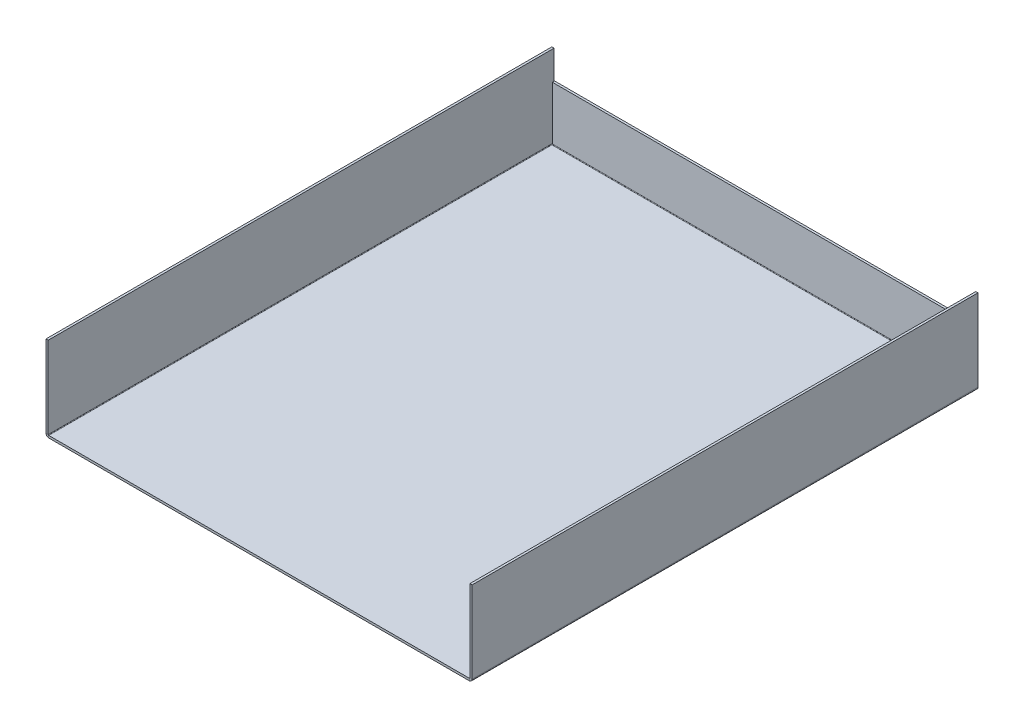
ISO-10303-21;
HEADER;
FILE_DESCRIPTION(('STEP AP214'),'2;1');
FILE_NAME('part.step','',(''),(''),'','','');
FILE_SCHEMA(('AUTOMOTIVE_DESIGN { 1 0 10303 214 1 1 1 1 }'));
ENDSEC;
DATA;
#1=APPLICATION_CONTEXT('core data for automotive mechanical design processes');
#2=APPLICATION_PROTOCOL_DEFINITION('international standard','automotive_design',2000,#1);
#3=PRODUCT_CONTEXT('',#1,'mechanical');
#4=PRODUCT('Part','Part','',(#3));
#5=PRODUCT_RELATED_PRODUCT_CATEGORY('part','',(#4));
#6=PRODUCT_DEFINITION_FORMATION('','',#4);
#7=PRODUCT_DEFINITION_CONTEXT('part definition',#1,'design');
#8=PRODUCT_DEFINITION('design','',#6,#7);
#9=PRODUCT_DEFINITION_SHAPE('','',#8);
#10=(LENGTH_UNIT() NAMED_UNIT(*) SI_UNIT(.MILLI.,.METRE.));
#11=(NAMED_UNIT(*) PLANE_ANGLE_UNIT() SI_UNIT($,.RADIAN.));
#12=(NAMED_UNIT(*) SI_UNIT($,.STERADIAN.) SOLID_ANGLE_UNIT());
#13=UNCERTAINTY_MEASURE_WITH_UNIT(LENGTH_MEASURE(1.E-05),#10,'distance_accuracy_value','');
#14=(GEOMETRIC_REPRESENTATION_CONTEXT(3) GLOBAL_UNCERTAINTY_ASSIGNED_CONTEXT((#13)) GLOBAL_UNIT_ASSIGNED_CONTEXT((#10,
#11,#12)) REPRESENTATION_CONTEXT('',''));
#15=CARTESIAN_POINT('',(0.,0.,0.));
#16=DIRECTION('',(0.,0.,1.));
#17=DIRECTION('',(1.,0.,0.));
#18=AXIS2_PLACEMENT_3D('',#15,#16,#17);
#19=CARTESIAN_POINT('',(299.2634,0.,3.9116));
#20=DIRECTION('',(-1.,0.,0.));
#21=DIRECTION('',(0.,0.,1.));
#22=AXIS2_PLACEMENT_3D('',#19,#20,#21);
#23=PLANE('',#22);
#24=DIRECTION('',(0.,0.,-1.));
#25=VECTOR('',#24,1.);
#26=CARTESIAN_POINT('',(299.2634,-3.175,720.));
#27=LINE('',#26,#25);
#28=CARTESIAN_POINT('',(299.2634,-3.175,3.9116));
#29=VERTEX_POINT('',#28);
#30=CARTESIAN_POINT('',(299.2634,-3.175,0.));
#31=VERTEX_POINT('',#30);
#32=EDGE_CURVE('E324',#29,#31,#27,.T.);
#33=ORIENTED_EDGE('',*,*,#32,.F.);
#34=CARTESIAN_POINT('',(299.2634,0.736599999999992,3.9116));
#35=DIRECTION('',(-1.,0.,0.));
#36=DIRECTION('',(0.,0.,1.));
#37=AXIS2_PLACEMENT_3D('',#34,#35,#36);
#38=CIRCLE('',#37,3.9116);
#39=CARTESIAN_POINT('',(299.2634,0.,0.0699812005874353));
#40=VERTEX_POINT('',#39);
#41=EDGE_CURVE('E76',#29,#40,#38,.F.);
#42=ORIENTED_EDGE('',*,*,#41,.T.);
#43=DIRECTION('',(0.,0.,-1.));
#44=VECTOR('',#43,1.);
#45=CARTESIAN_POINT('',(299.2634,0.,3.9116));
#46=LINE('',#45,#44);
#47=CARTESIAN_POINT('',(299.2634,0.,0.));
#48=VERTEX_POINT('',#47);
#49=EDGE_CURVE('E239',#40,#48,#46,.T.);
#50=ORIENTED_EDGE('',*,*,#49,.T.);
#51=DIRECTION('',(0.,-1.,0.));
#52=VECTOR('',#51,1.);
#53=CARTESIAN_POINT('',(299.2634,0.,0.));
#54=LINE('',#53,#52);
#55=EDGE_CURVE('E356',#48,#31,#54,.T.);
#56=ORIENTED_EDGE('',*,*,#55,.T.);
#57=EDGE_LOOP('',(#33,#42,#50,#56));
#58=FACE_BOUND('',#57,.T.);
#59=ADVANCED_FACE('F59',(#58),#23,.T.);
#60=CARTESIAN_POINT('',(-299.2634,0.,0.));
#61=DIRECTION('',(1.,0.,0.));
#62=DIRECTION('',(0.,0.,-1.));
#63=AXIS2_PLACEMENT_3D('',#60,#61,#62);
#64=PLANE('',#63);
#65=DIRECTION('',(0.,0.,1.));
#66=VECTOR('',#65,1.);
#67=CARTESIAN_POINT('',(-299.2634,0.,0.));
#68=LINE('',#67,#66);
#69=CARTESIAN_POINT('',(-299.2634,0.,0.));
#70=VERTEX_POINT('',#69);
#71=CARTESIAN_POINT('',(-299.2634,0.,0.0699812005874353));
#72=VERTEX_POINT('',#71);
#73=EDGE_CURVE('E251',#70,#72,#68,.T.);
#74=ORIENTED_EDGE('',*,*,#73,.T.);
#75=CARTESIAN_POINT('',(-299.2634,0.736599999999992,3.9116));
#76=DIRECTION('',(-1.,0.,0.));
#77=DIRECTION('',(0.,0.,1.));
#78=AXIS2_PLACEMENT_3D('',#75,#76,#77);
#79=CIRCLE('',#78,3.9116);
#80=CARTESIAN_POINT('',(-299.2634,-3.175,3.9116));
#81=VERTEX_POINT('',#80);
#82=EDGE_CURVE('E13',#72,#81,#79,.T.);
#83=ORIENTED_EDGE('',*,*,#82,.T.);
#84=DIRECTION('',(0.,0.,-1.));
#85=VECTOR('',#84,1.);
#86=CARTESIAN_POINT('',(-299.2634,-3.175,720.));
#87=LINE('',#86,#85);
#88=CARTESIAN_POINT('',(-299.2634,-3.175,0.));
#89=VERTEX_POINT('',#88);
#90=EDGE_CURVE('E328',#81,#89,#87,.T.);
#91=ORIENTED_EDGE('',*,*,#90,.T.);
#92=DIRECTION('',(0.,1.,0.));
#93=VECTOR('',#92,1.);
#94=CARTESIAN_POINT('',(-299.2634,-3.175,0.));
#95=LINE('',#94,#93);
#96=EDGE_CURVE('E362',#89,#70,#95,.T.);
#97=ORIENTED_EDGE('',*,*,#96,.T.);
#98=EDGE_LOOP('',(#74,#83,#91,#97));
#99=FACE_BOUND('',#98,.T.);
#100=ADVANCED_FACE('F432',(#99),#64,.T.);
#101=CARTESIAN_POINT('',(-300.,0.,720.));
#102=DIRECTION('',(0.,1.,0.));
#103=DIRECTION('',(0.,0.,1.));
#104=AXIS2_PLACEMENT_3D('',#101,#102,#103);
#105=PLANE('',#104);
#106=DIRECTION('',(0.,0.,-1.));
#107=VECTOR('',#106,1.);
#108=CARTESIAN_POINT('',(299.2634,0.,720.));
#109=LINE('',#108,#107);
#110=CARTESIAN_POINT('',(299.2634,0.,720.));
#111=VERTEX_POINT('',#110);
#112=CARTESIAN_POINT('',(299.2634,0.,3.9116));
#113=VERTEX_POINT('',#112);
#114=EDGE_CURVE('E344',#111,#113,#109,.T.);
#115=ORIENTED_EDGE('',*,*,#114,.T.);
#116=DIRECTION('',(-1.,0.,0.));
#117=VECTOR('',#116,1.);
#118=CARTESIAN_POINT('',(-299.2634,0.,3.9116));
#119=LINE('',#118,#117);
#120=CARTESIAN_POINT('',(-299.2634,0.,3.9116));
#121=VERTEX_POINT('',#120);
#122=EDGE_CURVE('E245',#121,#113,#119,.F.);
#123=ORIENTED_EDGE('',*,*,#122,.F.);
#124=DIRECTION('',(0.,0.,-1.));
#125=VECTOR('',#124,1.);
#126=CARTESIAN_POINT('',(-299.2634,0.,720.));
#127=LINE('',#126,#125);
#128=CARTESIAN_POINT('',(-299.2634,0.,720.));
#129=VERTEX_POINT('',#128);
#130=EDGE_CURVE('E342',#129,#121,#127,.T.);
#131=ORIENTED_EDGE('',*,*,#130,.F.);
#132=DIRECTION('',(1.,0.,0.));
#133=VECTOR('',#132,1.);
#134=CARTESIAN_POINT('',(-300.,0.,720.));
#135=LINE('',#134,#133);
#136=EDGE_CURVE('E269',#129,#111,#135,.T.);
#137=ORIENTED_EDGE('',*,*,#136,.T.);
#138=EDGE_LOOP('',(#115,#123,#131,#137));
#139=FACE_BOUND('',#138,.T.);
#140=ADVANCED_FACE('F401',(#139),#105,.T.);
#141=CARTESIAN_POINT('',(-300.,-3.175,720.));
#142=DIRECTION('',(0.,1.,0.));
#143=DIRECTION('',(0.,0.,1.));
#144=AXIS2_PLACEMENT_3D('',#141,#142,#143);
#145=PLANE('',#144);
#146=DIRECTION('',(-1.,0.,0.));
#147=VECTOR('',#146,1.);
#148=CARTESIAN_POINT('',(-299.2634,-3.17500000000001,3.9116));
#149=LINE('',#148,#147);
#150=EDGE_CURVE('E235',#81,#29,#149,.F.);
#151=ORIENTED_EDGE('',*,*,#150,.T.);
#152=CARTESIAN_POINT('',(299.2634,-3.175,720.));
#153=VERTEX_POINT('',#152);
#154=EDGE_CURVE('E325',#153,#29,#27,.T.);
#155=ORIENTED_EDGE('',*,*,#154,.F.);
#156=DIRECTION('',(1.,0.,0.));
#157=VECTOR('',#156,1.);
#158=CARTESIAN_POINT('',(-300.,-3.175,720.));
#159=LINE('',#158,#157);
#160=CARTESIAN_POINT('',(-299.2634,-3.175,720.));
#161=VERTEX_POINT('',#160);
#162=EDGE_CURVE('E287',#161,#153,#159,.T.);
#163=ORIENTED_EDGE('',*,*,#162,.F.);
#164=EDGE_CURVE('E329',#161,#81,#87,.T.);
#165=ORIENTED_EDGE('',*,*,#164,.T.);
#166=EDGE_LOOP('',(#151,#155,#163,#165));
#167=FACE_BOUND('',#166,.T.);
#168=ADVANCED_FACE('F384',(#167),#145,.F.);
#169=CARTESIAN_POINT('',(-299.2634,0.,720.));
#170=DIRECTION('',(0.,0.,1.));
#171=DIRECTION('',(1.,0.,0.));
#172=AXIS2_PLACEMENT_3D('',#169,#170,#171);
#173=PLANE('',#172);
#174=DIRECTION('',(0.,-1.,0.));
#175=VECTOR('',#174,1.);
#176=CARTESIAN_POINT('',(-299.2634,0.,720.));
#177=LINE('',#176,#175);
#178=EDGE_CURVE('E63',#129,#161,#177,.T.);
#179=ORIENTED_EDGE('',*,*,#178,.F.);
#180=CARTESIAN_POINT('',(-299.2634,0.736600000000002,720.));
#181=DIRECTION('',(0.,0.,-1.));
#182=DIRECTION('',(-1.,0.,0.));
#183=AXIS2_PLACEMENT_3D('',#180,#181,#182);
#184=CIRCLE('',#183,0.7366);
#185=CARTESIAN_POINT('',(-300.,0.736600000000004,720.));
#186=VERTEX_POINT('',#185);
#187=EDGE_CURVE('E272',#186,#129,#184,.F.);
#188=ORIENTED_EDGE('',*,*,#187,.F.);
#189=DIRECTION('',(1.,0.,0.));
#190=VECTOR('',#189,1.);
#191=CARTESIAN_POINT('',(-303.175,0.736600000000013,720.));
#192=LINE('',#191,#190);
#193=CARTESIAN_POINT('',(-303.175,0.736600000000013,720.));
#194=VERTEX_POINT('',#193);
#195=EDGE_CURVE('E365',#194,#186,#192,.T.);
#196=ORIENTED_EDGE('',*,*,#195,.F.);
#197=CARTESIAN_POINT('',(-299.2634,0.736600000000002,720.));
#198=DIRECTION('',(0.,0.,1.));
#199=DIRECTION('',(1.,0.,0.));
#200=AXIS2_PLACEMENT_3D('',#197,#198,#199);
#201=CIRCLE('',#200,3.9116);
#202=EDGE_CURVE('E284',#194,#161,#201,.T.);
#203=ORIENTED_EDGE('',*,*,#202,.T.);
#204=EDGE_LOOP('',(#179,#188,#196,#203));
#205=FACE_BOUND('',#204,.T.);
#206=ADVANCED_FACE('F61',(#205),#173,.T.);
#207=CARTESIAN_POINT('',(-303.175,0.736600000000013,720.));
#208=DIRECTION('',(0.,0.,1.));
#209=DIRECTION('',(1.,0.,0.));
#210=AXIS2_PLACEMENT_3D('',#207,#208,#209);
#211=PLANE('',#210);
#212=ORIENTED_EDGE('',*,*,#136,.F.);
#213=ORIENTED_EDGE('',*,*,#178,.T.);
#214=ORIENTED_EDGE('',*,*,#162,.T.);
#215=DIRECTION('',(0.,1.,0.));
#216=VECTOR('',#215,1.);
#217=CARTESIAN_POINT('',(299.2634,-3.175,720.));
#218=LINE('',#217,#216);
#219=EDGE_CURVE('E358',#153,#111,#218,.T.);
#220=ORIENTED_EDGE('',*,*,#219,.T.);
#221=EDGE_LOOP('',(#212,#213,#214,#220));
#222=FACE_BOUND('',#221,.T.);
#223=ADVANCED_FACE('F371',(#222),#211,.T.);
#224=CARTESIAN_POINT('',(-300.,0.736600000000004,0.));
#225=DIRECTION('',(0.,0.,-1.));
#226=DIRECTION('',(-1.,0.,0.));
#227=AXIS2_PLACEMENT_3D('',#224,#225,#226);
#228=PLANE('',#227);
#229=DIRECTION('',(-1.,0.,0.));
#230=VECTOR('',#229,1.);
#231=CARTESIAN_POINT('',(-300.,0.736600000000004,0.));
#232=LINE('',#231,#230);
#233=CARTESIAN_POINT('',(-300.,0.736600000000004,0.));
#234=VERTEX_POINT('',#233);
#235=CARTESIAN_POINT('',(-303.175,0.736600000000013,0.));
#236=VERTEX_POINT('',#235);
#237=EDGE_CURVE('E364',#234,#236,#232,.T.);
#238=ORIENTED_EDGE('',*,*,#237,.F.);
#239=CARTESIAN_POINT('',(-299.2634,0.736600000000002,0.));
#240=DIRECTION('',(0.,0.,-1.));
#241=DIRECTION('',(-1.,0.,0.));
#242=AXIS2_PLACEMENT_3D('',#239,#240,#241);
#243=CIRCLE('',#242,0.7366);
#244=EDGE_CURVE('E305',#234,#70,#243,.F.);
#245=ORIENTED_EDGE('',*,*,#244,.T.);
#246=ORIENTED_EDGE('',*,*,#96,.F.);
#247=CARTESIAN_POINT('',(-299.2634,0.736600000000002,0.));
#248=DIRECTION('',(0.,0.,1.));
#249=DIRECTION('',(1.,0.,0.));
#250=AXIS2_PLACEMENT_3D('',#247,#248,#249);
#251=CIRCLE('',#250,3.9116);
#252=EDGE_CURVE('E317',#236,#89,#251,.T.);
#253=ORIENTED_EDGE('',*,*,#252,.F.);
#254=EDGE_LOOP('',(#238,#245,#246,#253));
#255=FACE_BOUND('',#254,.T.);
#256=ADVANCED_FACE('F495',(#255),#228,.T.);
#257=CARTESIAN_POINT('',(-299.2634,-3.175,0.));
#258=DIRECTION('',(0.,0.,-1.));
#259=DIRECTION('',(-1.,0.,0.));
#260=AXIS2_PLACEMENT_3D('',#257,#258,#259);
#261=PLANE('',#260);
#262=DIRECTION('',(0.,-1.,0.));
#263=VECTOR('',#262,1.);
#264=CARTESIAN_POINT('',(-300.,117.,0.));
#265=LINE('',#264,#263);
#266=CARTESIAN_POINT('',(-300.,117.,0.));
#267=VERTEX_POINT('',#266);
#268=EDGE_CURVE('E308',#267,#234,#265,.T.);
#269=ORIENTED_EDGE('',*,*,#268,.T.);
#270=ORIENTED_EDGE('',*,*,#237,.T.);
#271=DIRECTION('',(0.,-1.,0.));
#272=VECTOR('',#271,1.);
#273=CARTESIAN_POINT('',(-303.175,117.,0.));
#274=LINE('',#273,#272);
#275=CARTESIAN_POINT('',(-303.175,117.,0.));
#276=VERTEX_POINT('',#275);
#277=EDGE_CURVE('E314',#276,#236,#274,.T.);
#278=ORIENTED_EDGE('',*,*,#277,.F.);
#279=DIRECTION('',(1.,0.,0.));
#280=VECTOR('',#279,1.);
#281=CARTESIAN_POINT('',(-303.175,117.,0.));
#282=LINE('',#281,#280);
#283=EDGE_CURVE('E311',#276,#267,#282,.T.);
#284=ORIENTED_EDGE('',*,*,#283,.T.);
#285=EDGE_LOOP('',(#269,#270,#278,#284));
#286=FACE_BOUND('',#285,.T.);
#287=ADVANCED_FACE('F492',(#286),#261,.T.);
#288=CARTESIAN_POINT('',(300.,0.7366,720.));
#289=DIRECTION('',(0.,0.,1.));
#290=DIRECTION('',(1.,0.,0.));
#291=AXIS2_PLACEMENT_3D('',#288,#289,#290);
#292=PLANE('',#291);
#293=DIRECTION('',(1.,0.,0.));
#294=VECTOR('',#293,1.);
#295=CARTESIAN_POINT('',(300.,0.7366,720.));
#296=LINE('',#295,#294);
#297=CARTESIAN_POINT('',(300.,0.7366,720.));
#298=VERTEX_POINT('',#297);
#299=CARTESIAN_POINT('',(303.175,0.736600000000002,720.));
#300=VERTEX_POINT('',#299);
#301=EDGE_CURVE('E360',#298,#300,#296,.T.);
#302=ORIENTED_EDGE('',*,*,#301,.F.);
#303=CARTESIAN_POINT('',(299.2634,0.7366,720.));
#304=DIRECTION('',(0.,0.,-1.));
#305=DIRECTION('',(-1.,0.,0.));
#306=AXIS2_PLACEMENT_3D('',#303,#304,#305);
#307=CIRCLE('',#306,0.7366);
#308=EDGE_CURVE('E266',#111,#298,#307,.F.);
#309=ORIENTED_EDGE('',*,*,#308,.F.);
#310=ORIENTED_EDGE('',*,*,#219,.F.);
#311=CARTESIAN_POINT('',(299.2634,0.7366,720.));
#312=DIRECTION('',(0.,0.,1.));
#313=DIRECTION('',(1.,0.,0.));
#314=AXIS2_PLACEMENT_3D('',#311,#312,#313);
#315=CIRCLE('',#314,3.9116);
#316=EDGE_CURVE('E290',#153,#300,#315,.T.);
#317=ORIENTED_EDGE('',*,*,#316,.T.);
#318=EDGE_LOOP('',(#302,#309,#310,#317));
#319=FACE_BOUND('',#318,.T.);
#320=ADVANCED_FACE('F392',(#319),#292,.T.);
#321=CARTESIAN_POINT('',(299.2634,-3.175,720.));
#322=DIRECTION('',(0.,0.,1.));
#323=DIRECTION('',(1.,0.,0.));
#324=AXIS2_PLACEMENT_3D('',#321,#322,#323);
#325=PLANE('',#324);
#326=DIRECTION('',(0.,1.,0.));
#327=VECTOR('',#326,1.);
#328=CARTESIAN_POINT('',(300.,0.,720.));
#329=LINE('',#328,#327);
#330=CARTESIAN_POINT('',(300.,117.,720.));
#331=VERTEX_POINT('',#330);
#332=EDGE_CURVE('E263',#298,#331,#329,.T.);
#333=ORIENTED_EDGE('',*,*,#332,.F.);
#334=ORIENTED_EDGE('',*,*,#301,.T.);
#335=DIRECTION('',(0.,1.,0.));
#336=VECTOR('',#335,1.);
#337=CARTESIAN_POINT('',(303.175,0.,720.));
#338=LINE('',#337,#336);
#339=CARTESIAN_POINT('',(303.175,117.,720.));
#340=VERTEX_POINT('',#339);
#341=EDGE_CURVE('E257',#300,#340,#338,.T.);
#342=ORIENTED_EDGE('',*,*,#341,.T.);
#343=DIRECTION('',(1.,0.,0.));
#344=VECTOR('',#343,1.);
#345=CARTESIAN_POINT('',(300.,117.,720.));
#346=LINE('',#345,#344);
#347=EDGE_CURVE('E259',#331,#340,#346,.T.);
#348=ORIENTED_EDGE('',*,*,#347,.F.);
#349=EDGE_LOOP('',(#333,#334,#342,#348));
#350=FACE_BOUND('',#349,.T.);
#351=ADVANCED_FACE('F485',(#350),#325,.T.);
#352=CARTESIAN_POINT('',(299.2634,0.,0.));
#353=DIRECTION('',(0.,0.,-1.));
#354=DIRECTION('',(-1.,0.,0.));
#355=AXIS2_PLACEMENT_3D('',#352,#353,#354);
#356=PLANE('',#355);
#357=ORIENTED_EDGE('',*,*,#55,.F.);
#358=CARTESIAN_POINT('',(299.2634,0.7366,0.));
#359=DIRECTION('',(0.,0.,-1.));
#360=DIRECTION('',(-1.,0.,0.));
#361=AXIS2_PLACEMENT_3D('',#358,#359,#360);
#362=CIRCLE('',#361,0.7366);
#363=CARTESIAN_POINT('',(300.,0.7366,0.));
#364=VERTEX_POINT('',#363);
#365=EDGE_CURVE('E302',#48,#364,#362,.F.);
#366=ORIENTED_EDGE('',*,*,#365,.T.);
#367=DIRECTION('',(-1.,0.,0.));
#368=VECTOR('',#367,1.);
#369=CARTESIAN_POINT('',(303.175,0.736600000000002,0.));
#370=LINE('',#369,#368);
#371=CARTESIAN_POINT('',(303.175,0.736600000000002,0.));
#372=VERTEX_POINT('',#371);
#373=EDGE_CURVE('E354',#372,#364,#370,.T.);
#374=ORIENTED_EDGE('',*,*,#373,.F.);
#375=CARTESIAN_POINT('',(299.2634,0.7366,0.));
#376=DIRECTION('',(0.,0.,1.));
#377=DIRECTION('',(1.,0.,0.));
#378=AXIS2_PLACEMENT_3D('',#375,#376,#377);
#379=CIRCLE('',#378,3.9116);
#380=EDGE_CURVE('E260',#31,#372,#379,.T.);
#381=ORIENTED_EDGE('',*,*,#380,.F.);
#382=EDGE_LOOP('',(#357,#366,#374,#381));
#383=FACE_BOUND('',#382,.T.);
#384=ADVANCED_FACE('F481',(#383),#356,.T.);
#385=CARTESIAN_POINT('',(303.175,0.,720.));
#386=DIRECTION('',(-1.,0.,0.));
#387=DIRECTION('',(0.,-1.,0.));
#388=AXIS2_PLACEMENT_3D('',#385,#386,#387);
#389=PLANE('',#388);
#390=DIRECTION('',(0.,1.,0.));
#391=VECTOR('',#390,1.);
#392=CARTESIAN_POINT('',(303.175,0.,0.));
#393=LINE('',#392,#391);
#394=CARTESIAN_POINT('',(303.175,117.,0.));
#395=VERTEX_POINT('',#394);
#396=EDGE_CURVE('E253',#372,#395,#393,.T.);
#397=ORIENTED_EDGE('',*,*,#396,.T.);
#398=DIRECTION('',(0.,0.,-1.));
#399=VECTOR('',#398,1.);
#400=CARTESIAN_POINT('',(303.175,117.,720.));
#401=LINE('',#400,#399);
#402=EDGE_CURVE('E352',#340,#395,#401,.T.);
#403=ORIENTED_EDGE('',*,*,#402,.F.);
#404=ORIENTED_EDGE('',*,*,#341,.F.);
#405=DIRECTION('',(0.,0.,-1.));
#406=VECTOR('',#405,1.);
#407=CARTESIAN_POINT('',(303.175,0.736600000000002,720.));
#408=LINE('',#407,#406);
#409=EDGE_CURVE('E293',#300,#372,#408,.T.);
#410=ORIENTED_EDGE('',*,*,#409,.T.);
#411=EDGE_LOOP('',(#397,#403,#404,#410));
#412=FACE_BOUND('',#411,.T.);
#413=ADVANCED_FACE('F477',(#412),#389,.F.);
#414=CARTESIAN_POINT('',(300.,117.,720.));
#415=DIRECTION('',(0.,1.,0.));
#416=DIRECTION('',(0.,0.,1.));
#417=AXIS2_PLACEMENT_3D('',#414,#415,#416);
#418=PLANE('',#417);
#419=DIRECTION('',(1.,0.,0.));
#420=VECTOR('',#419,1.);
#421=CARTESIAN_POINT('',(300.,117.,0.));
#422=LINE('',#421,#420);
#423=CARTESIAN_POINT('',(300.,117.,0.));
#424=VERTEX_POINT('',#423);
#425=EDGE_CURVE('E296',#424,#395,#422,.T.);
#426=ORIENTED_EDGE('',*,*,#425,.F.);
#427=DIRECTION('',(0.,0.,-1.));
#428=VECTOR('',#427,1.);
#429=CARTESIAN_POINT('',(300.,117.,720.));
#430=LINE('',#429,#428);
#431=EDGE_CURVE('E350',#331,#424,#430,.T.);
#432=ORIENTED_EDGE('',*,*,#431,.F.);
#433=ORIENTED_EDGE('',*,*,#347,.T.);
#434=ORIENTED_EDGE('',*,*,#402,.T.);
#435=EDGE_LOOP('',(#426,#432,#433,#434));
#436=FACE_BOUND('',#435,.T.);
#437=ADVANCED_FACE('F473',(#436),#418,.T.);
#438=CARTESIAN_POINT('',(300.,0.,720.));
#439=DIRECTION('',(-1.,0.,0.));
#440=DIRECTION('',(0.,-1.,0.));
#441=AXIS2_PLACEMENT_3D('',#438,#439,#440);
#442=PLANE('',#441);
#443=DIRECTION('',(0.,1.,0.));
#444=VECTOR('',#443,1.);
#445=CARTESIAN_POINT('',(300.,0.,0.));
#446=LINE('',#445,#444);
#447=EDGE_CURVE('E299',#364,#424,#446,.T.);
#448=ORIENTED_EDGE('',*,*,#447,.F.);
#449=DIRECTION('',(0.,0.,-1.));
#450=VECTOR('',#449,1.);
#451=CARTESIAN_POINT('',(300.,0.7366,720.));
#452=LINE('',#451,#450);
#453=EDGE_CURVE('E347',#298,#364,#452,.T.);
#454=ORIENTED_EDGE('',*,*,#453,.F.);
#455=ORIENTED_EDGE('',*,*,#332,.T.);
#456=ORIENTED_EDGE('',*,*,#431,.T.);
#457=EDGE_LOOP('',(#448,#454,#455,#456));
#458=FACE_BOUND('',#457,.T.);
#459=ADVANCED_FACE('F470',(#458),#442,.T.);
#460=CARTESIAN_POINT('',(299.2634,0.7366,720.));
#461=DIRECTION('',(0.,0.,-1.));
#462=DIRECTION('',(-1.,0.,0.));
#463=AXIS2_PLACEMENT_3D('',#460,#461,#462);
#464=CYLINDRICAL_SURFACE('',#463,0.7366);
#465=ORIENTED_EDGE('',*,*,#365,.F.);
#466=ORIENTED_EDGE('',*,*,#49,.F.);
#467=EDGE_CURVE('E254',#113,#40,#46,.T.);
#468=ORIENTED_EDGE('',*,*,#467,.F.);
#469=ORIENTED_EDGE('',*,*,#114,.F.);
#470=ORIENTED_EDGE('',*,*,#308,.T.);
#471=ORIENTED_EDGE('',*,*,#453,.T.);
#472=EDGE_LOOP('',(#465,#466,#468,#469,#470,#471));
#473=FACE_BOUND('',#472,.T.);
#474=ADVANCED_FACE('F398',(#473),#464,.F.);
#475=CARTESIAN_POINT('',(-299.2634,0.736600000000002,720.));
#476=DIRECTION('',(0.,0.,-1.));
#477=DIRECTION('',(-1.,0.,0.));
#478=AXIS2_PLACEMENT_3D('',#475,#476,#477);
#479=CYLINDRICAL_SURFACE('',#478,0.7366);
#480=ORIENTED_EDGE('',*,*,#244,.F.);
#481=DIRECTION('',(0.,0.,-1.));
#482=VECTOR('',#481,1.);
#483=CARTESIAN_POINT('',(-300.,0.736600000000004,720.));
#484=LINE('',#483,#482);
#485=EDGE_CURVE('E339',#186,#234,#484,.T.);
#486=ORIENTED_EDGE('',*,*,#485,.F.);
#487=ORIENTED_EDGE('',*,*,#187,.T.);
#488=ORIENTED_EDGE('',*,*,#130,.T.);
#489=EDGE_CURVE('E84',#72,#121,#68,.T.);
#490=ORIENTED_EDGE('',*,*,#489,.F.);
#491=ORIENTED_EDGE('',*,*,#73,.F.);
#492=EDGE_LOOP('',(#480,#486,#487,#488,#490,#491));
#493=FACE_BOUND('',#492,.T.);
#494=ADVANCED_FACE('F462',(#493),#479,.F.);
#495=CARTESIAN_POINT('',(-300.,117.,720.));
#496=DIRECTION('',(1.,0.,0.));
#497=DIRECTION('',(0.,1.,0.));
#498=AXIS2_PLACEMENT_3D('',#495,#496,#497);
#499=PLANE('',#498);
#500=ORIENTED_EDGE('',*,*,#268,.F.);
#501=DIRECTION('',(0.,0.,-1.));
#502=VECTOR('',#501,1.);
#503=CARTESIAN_POINT('',(-300.,117.,720.));
#504=LINE('',#503,#502);
#505=CARTESIAN_POINT('',(-300.,117.,720.));
#506=VERTEX_POINT('',#505);
#507=EDGE_CURVE('E337',#506,#267,#504,.T.);
#508=ORIENTED_EDGE('',*,*,#507,.F.);
#509=DIRECTION('',(0.,-1.,0.));
#510=VECTOR('',#509,1.);
#511=CARTESIAN_POINT('',(-300.,117.,720.));
#512=LINE('',#511,#510);
#513=EDGE_CURVE('E275',#506,#186,#512,.T.);
#514=ORIENTED_EDGE('',*,*,#513,.T.);
#515=ORIENTED_EDGE('',*,*,#485,.T.);
#516=EDGE_LOOP('',(#500,#508,#514,#515));
#517=FACE_BOUND('',#516,.T.);
#518=ADVANCED_FACE('F458',(#517),#499,.T.);
#519=CARTESIAN_POINT('',(-303.175,117.,720.));
#520=DIRECTION('',(0.,1.,0.));
#521=DIRECTION('',(0.,0.,1.));
#522=AXIS2_PLACEMENT_3D('',#519,#520,#521);
#523=PLANE('',#522);
#524=ORIENTED_EDGE('',*,*,#283,.F.);
#525=DIRECTION('',(0.,0.,-1.));
#526=VECTOR('',#525,1.);
#527=CARTESIAN_POINT('',(-303.175,117.,720.));
#528=LINE('',#527,#526);
#529=CARTESIAN_POINT('',(-303.175,117.,720.));
#530=VERTEX_POINT('',#529);
#531=EDGE_CURVE('E335',#530,#276,#528,.T.);
#532=ORIENTED_EDGE('',*,*,#531,.F.);
#533=DIRECTION('',(1.,0.,0.));
#534=VECTOR('',#533,1.);
#535=CARTESIAN_POINT('',(-303.175,117.,720.));
#536=LINE('',#535,#534);
#537=EDGE_CURVE('E278',#530,#506,#536,.T.);
#538=ORIENTED_EDGE('',*,*,#537,.T.);
#539=ORIENTED_EDGE('',*,*,#507,.T.);
#540=EDGE_LOOP('',(#524,#532,#538,#539));
#541=FACE_BOUND('',#540,.T.);
#542=ADVANCED_FACE('F454',(#541),#523,.T.);
#543=CARTESIAN_POINT('',(-303.175,117.,720.));
#544=DIRECTION('',(1.,0.,0.));
#545=DIRECTION('',(0.,1.,0.));
#546=AXIS2_PLACEMENT_3D('',#543,#544,#545);
#547=PLANE('',#546);
#548=ORIENTED_EDGE('',*,*,#277,.T.);
#549=DIRECTION('',(0.,0.,-1.));
#550=VECTOR('',#549,1.);
#551=CARTESIAN_POINT('',(-303.175,0.736600000000013,720.));
#552=LINE('',#551,#550);
#553=EDGE_CURVE('E332',#194,#236,#552,.T.);
#554=ORIENTED_EDGE('',*,*,#553,.F.);
#555=DIRECTION('',(0.,-1.,0.));
#556=VECTOR('',#555,1.);
#557=CARTESIAN_POINT('',(-303.175,117.,720.));
#558=LINE('',#557,#556);
#559=EDGE_CURVE('E281',#530,#194,#558,.T.);
#560=ORIENTED_EDGE('',*,*,#559,.F.);
#561=ORIENTED_EDGE('',*,*,#531,.T.);
#562=EDGE_LOOP('',(#548,#554,#560,#561));
#563=FACE_BOUND('',#562,.T.);
#564=ADVANCED_FACE('F451',(#563),#547,.F.);
#565=CARTESIAN_POINT('',(-299.2634,0.736600000000002,720.));
#566=DIRECTION('',(0.,0.,-1.));
#567=DIRECTION('',(-1.,0.,0.));
#568=AXIS2_PLACEMENT_3D('',#565,#566,#567);
#569=CYLINDRICAL_SURFACE('',#568,3.9116);
#570=ORIENTED_EDGE('',*,*,#252,.T.);
#571=ORIENTED_EDGE('',*,*,#90,.F.);
#572=ORIENTED_EDGE('',*,*,#164,.F.);
#573=ORIENTED_EDGE('',*,*,#202,.F.);
#574=ORIENTED_EDGE('',*,*,#553,.T.);
#575=EDGE_LOOP('',(#570,#571,#572,#573,#574));
#576=FACE_BOUND('',#575,.T.);
#577=ADVANCED_FACE('F381',(#576),#569,.T.);
#578=CARTESIAN_POINT('',(299.2634,0.7366,720.));
#579=DIRECTION('',(0.,0.,-1.));
#580=DIRECTION('',(-1.,0.,0.));
#581=AXIS2_PLACEMENT_3D('',#578,#579,#580);
#582=CYLINDRICAL_SURFACE('',#581,3.9116);
#583=ORIENTED_EDGE('',*,*,#380,.T.);
#584=ORIENTED_EDGE('',*,*,#409,.F.);
#585=ORIENTED_EDGE('',*,*,#316,.F.);
#586=ORIENTED_EDGE('',*,*,#154,.T.);
#587=ORIENTED_EDGE('',*,*,#32,.T.);
#588=EDGE_LOOP('',(#583,#584,#585,#586,#587));
#589=FACE_BOUND('',#588,.T.);
#590=ADVANCED_FACE('F389',(#589),#582,.T.);
#591=CARTESIAN_POINT('',(299.2634,0.7366,720.));
#592=DIRECTION('',(0.,0.,-1.));
#593=DIRECTION('',(-1.,0.,0.));
#594=AXIS2_PLACEMENT_3D('',#591,#592,#593);
#595=PLANE('',#594);
#596=ORIENTED_EDGE('',*,*,#559,.T.);
#597=ORIENTED_EDGE('',*,*,#195,.T.);
#598=ORIENTED_EDGE('',*,*,#513,.F.);
#599=ORIENTED_EDGE('',*,*,#537,.F.);
#600=EDGE_LOOP('',(#596,#597,#598,#599));
#601=FACE_BOUND('',#600,.T.);
#602=ADVANCED_FACE('F439',(#601),#595,.F.);
#603=CARTESIAN_POINT('',(299.2634,0.7366,0.));
#604=DIRECTION('',(0.,0.,-1.));
#605=DIRECTION('',(-1.,0.,0.));
#606=AXIS2_PLACEMENT_3D('',#603,#604,#605);
#607=PLANE('',#606);
#608=ORIENTED_EDGE('',*,*,#396,.F.);
#609=ORIENTED_EDGE('',*,*,#373,.T.);
#610=ORIENTED_EDGE('',*,*,#447,.T.);
#611=ORIENTED_EDGE('',*,*,#425,.T.);
#612=EDGE_LOOP('',(#608,#609,#610,#611));
#613=FACE_BOUND('',#612,.T.);
#614=ADVANCED_FACE('F428',(#613),#607,.T.);
#615=CARTESIAN_POINT('',(299.2634,0.736599999999992,3.9116));
#616=DIRECTION('',(1.,0.,0.));
#617=DIRECTION('',(0.,0.,-1.));
#618=AXIS2_PLACEMENT_3D('',#615,#616,#617);
#619=PLANE('',#618);
#620=CARTESIAN_POINT('',(299.2634,0.736599999999992,3.9116));
#621=DIRECTION('',(-1.,0.,0.));
#622=DIRECTION('',(0.,0.,1.));
#623=AXIS2_PLACEMENT_3D('',#620,#621,#622);
#624=CIRCLE('',#623,0.7366);
#625=CARTESIAN_POINT('',(299.2634,0.73659999999999,3.175));
#626=VERTEX_POINT('',#625);
#627=EDGE_CURVE('E242',#113,#626,#624,.F.);
#628=ORIENTED_EDGE('',*,*,#627,.F.);
#629=ORIENTED_EDGE('',*,*,#467,.T.);
#630=CARTESIAN_POINT('',(299.2634,0.736599999999978,0.));
#631=VERTEX_POINT('',#630);
#632=EDGE_CURVE('E238',#40,#631,#38,.F.);
#633=ORIENTED_EDGE('',*,*,#632,.T.);
#634=DIRECTION('',(0.,0.,1.));
#635=VECTOR('',#634,1.);
#636=CARTESIAN_POINT('',(299.2634,0.73660000000002,0.));
#637=LINE('',#636,#635);
#638=EDGE_CURVE('E216',#626,#631,#637,.F.);
#639=ORIENTED_EDGE('',*,*,#638,.F.);
#640=EDGE_LOOP('',(#628,#629,#633,#639));
#641=FACE_BOUND('',#640,.T.);
#642=ADVANCED_FACE('F408',(#641),#619,.T.);
#643=CARTESIAN_POINT('',(-299.2634,0.736599999999992,3.9116));
#644=DIRECTION('',(1.,0.,0.));
#645=DIRECTION('',(0.,0.,-1.));
#646=AXIS2_PLACEMENT_3D('',#643,#644,#645);
#647=PLANE('',#646);
#648=CARTESIAN_POINT('',(-299.2634,0.73660000000002,0.));
#649=VERTEX_POINT('',#648);
#650=EDGE_CURVE('E69',#649,#72,#79,.T.);
#651=ORIENTED_EDGE('',*,*,#650,.T.);
#652=ORIENTED_EDGE('',*,*,#489,.T.);
#653=CARTESIAN_POINT('',(-299.2634,0.736599999999992,3.9116));
#654=DIRECTION('',(-1.,0.,0.));
#655=DIRECTION('',(0.,0.,1.));
#656=AXIS2_PLACEMENT_3D('',#653,#654,#655);
#657=CIRCLE('',#656,0.7366);
#658=CARTESIAN_POINT('',(-299.2634,0.73659999999999,3.175));
#659=VERTEX_POINT('',#658);
#660=EDGE_CURVE('E248',#659,#121,#657,.T.);
#661=ORIENTED_EDGE('',*,*,#660,.F.);
#662=DIRECTION('',(0.,0.,1.));
#663=VECTOR('',#662,1.);
#664=CARTESIAN_POINT('',(-299.2634,0.736599999999997,3.175));
#665=LINE('',#664,#663);
#666=EDGE_CURVE('E229',#659,#649,#665,.F.);
#667=ORIENTED_EDGE('',*,*,#666,.T.);
#668=EDGE_LOOP('',(#651,#652,#661,#667));
#669=FACE_BOUND('',#668,.T.);
#670=ADVANCED_FACE('F420',(#669),#647,.F.);
#671=CARTESIAN_POINT('',(-299.2634,0.736599999999992,3.9116));
#672=DIRECTION('',(-1.,0.,0.));
#673=DIRECTION('',(0.,0.,-1.));
#674=AXIS2_PLACEMENT_3D('',#671,#672,#673);
#675=CYLINDRICAL_SURFACE('',#674,3.9116);
#676=ORIENTED_EDGE('',*,*,#150,.F.);
#677=ORIENTED_EDGE('',*,*,#82,.F.);
#678=ORIENTED_EDGE('',*,*,#650,.F.);
#679=DIRECTION('',(-1.,0.,0.));
#680=VECTOR('',#679,1.);
#681=CARTESIAN_POINT('',(299.2634,0.73660000000002,0.));
#682=LINE('',#681,#680);
#683=EDGE_CURVE('E226',#649,#631,#682,.F.);
#684=ORIENTED_EDGE('',*,*,#683,.T.);
#685=ORIENTED_EDGE('',*,*,#632,.F.);
#686=ORIENTED_EDGE('',*,*,#41,.F.);
#687=EDGE_LOOP('',(#676,#677,#678,#684,#685,#686));
#688=FACE_BOUND('',#687,.T.);
#689=ADVANCED_FACE('F411',(#688),#675,.T.);
#690=CARTESIAN_POINT('',(-299.2634,0.736599999999992,3.9116));
#691=DIRECTION('',(-1.,0.,0.));
#692=DIRECTION('',(0.,0.,-1.));
#693=AXIS2_PLACEMENT_3D('',#690,#691,#692);
#694=CYLINDRICAL_SURFACE('',#693,0.7366);
#695=ORIENTED_EDGE('',*,*,#122,.T.);
#696=ORIENTED_EDGE('',*,*,#627,.T.);
#697=DIRECTION('',(-1.,0.,0.));
#698=VECTOR('',#697,1.);
#699=CARTESIAN_POINT('',(299.2634,0.736599999999997,3.175));
#700=LINE('',#699,#698);
#701=EDGE_CURVE('E232',#626,#659,#700,.T.);
#702=ORIENTED_EDGE('',*,*,#701,.T.);
#703=ORIENTED_EDGE('',*,*,#660,.T.);
#704=EDGE_LOOP('',(#695,#696,#702,#703));
#705=FACE_BOUND('',#704,.T.);
#706=ADVANCED_FACE('F404',(#705),#694,.F.);
#707=CARTESIAN_POINT('',(-299.2634,76.825,-2.68448457907411E-13));
#708=DIRECTION('',(1.,0.,0.));
#709=DIRECTION('',(0.,0.,-1.));
#710=AXIS2_PLACEMENT_3D('',#707,#708,#709);
#711=PLANE('',#710);
#712=ORIENTED_EDGE('',*,*,#666,.F.);
#713=DIRECTION('',(0.,-1.,0.));
#714=VECTOR('',#713,1.);
#715=CARTESIAN_POINT('',(-299.2634,76.825,3.17499999999973));
#716=LINE('',#715,#714);
#717=CARTESIAN_POINT('',(-299.2634,76.825,3.17499999999973));
#718=VERTEX_POINT('',#717);
#719=EDGE_CURVE('E224',#659,#718,#716,.F.);
#720=ORIENTED_EDGE('',*,*,#719,.T.);
#721=DIRECTION('',(0.,0.,1.));
#722=VECTOR('',#721,1.);
#723=CARTESIAN_POINT('',(-299.2634,76.825,-2.68448457907411E-13));
#724=LINE('',#723,#722);
#725=CARTESIAN_POINT('',(-299.2634,76.825,-2.68233053856624E-13));
#726=VERTEX_POINT('',#725);
#727=EDGE_CURVE('E212',#726,#718,#724,.T.);
#728=ORIENTED_EDGE('',*,*,#727,.F.);
#729=DIRECTION('',(0.,1.,0.));
#730=VECTOR('',#729,1.);
#731=CARTESIAN_POINT('',(-299.2634,0.,0.));
#732=LINE('',#731,#730);
#733=EDGE_CURVE('E199',#649,#726,#732,.T.);
#734=ORIENTED_EDGE('',*,*,#733,.F.);
#735=EDGE_LOOP('',(#712,#720,#728,#734));
#736=FACE_BOUND('',#735,.T.);
#737=ADVANCED_FACE('F415',(#736),#711,.F.);
#738=CARTESIAN_POINT('',(299.2634,0.,0.));
#739=DIRECTION('',(-1.,0.,0.));
#740=DIRECTION('',(0.,0.,1.));
#741=AXIS2_PLACEMENT_3D('',#738,#739,#740);
#742=PLANE('',#741);
#743=ORIENTED_EDGE('',*,*,#638,.T.);
#744=DIRECTION('',(0.,-1.,0.));
#745=VECTOR('',#744,1.);
#746=CARTESIAN_POINT('',(299.2634,0.,0.));
#747=LINE('',#746,#745);
#748=CARTESIAN_POINT('',(299.2634,76.825,-2.68233053856624E-13));
#749=VERTEX_POINT('',#748);
#750=EDGE_CURVE('E197',#749,#631,#747,.T.);
#751=ORIENTED_EDGE('',*,*,#750,.F.);
#752=DIRECTION('',(0.,0.,1.));
#753=VECTOR('',#752,1.);
#754=CARTESIAN_POINT('',(299.2634,76.825,-2.68233053856624E-13));
#755=LINE('',#754,#753);
#756=CARTESIAN_POINT('',(299.2634,76.825,3.17499999999973));
#757=VERTEX_POINT('',#756);
#758=EDGE_CURVE('E205',#749,#757,#755,.T.);
#759=ORIENTED_EDGE('',*,*,#758,.T.);
#760=DIRECTION('',(0.,1.,0.));
#761=VECTOR('',#760,1.);
#762=CARTESIAN_POINT('',(299.2634,0.,3.175));
#763=LINE('',#762,#761);
#764=EDGE_CURVE('E221',#757,#626,#763,.F.);
#765=ORIENTED_EDGE('',*,*,#764,.T.);
#766=EDGE_LOOP('',(#743,#751,#759,#765));
#767=FACE_BOUND('',#766,.T.);
#768=ADVANCED_FACE('F215',(#767),#742,.F.);
#769=CARTESIAN_POINT('',(0.,0.,0.));
#770=DIRECTION('',(0.,0.,1.));
#771=DIRECTION('',(0.,-1.,0.));
#772=AXIS2_PLACEMENT_3D('',#769,#770,#771);
#773=PLANE('',#772);
#774=ORIENTED_EDGE('',*,*,#683,.F.);
#775=ORIENTED_EDGE('',*,*,#733,.T.);
#776=DIRECTION('',(1.,0.,0.));
#777=VECTOR('',#776,1.);
#778=CARTESIAN_POINT('',(0.,76.825,-2.68233053856624E-13));
#779=LINE('',#778,#777);
#780=EDGE_CURVE('E192',#726,#749,#779,.T.);
#781=ORIENTED_EDGE('',*,*,#780,.T.);
#782=ORIENTED_EDGE('',*,*,#750,.T.);
#783=EDGE_LOOP('',(#774,#775,#781,#782));
#784=FACE_BOUND('',#783,.T.);
#785=ADVANCED_FACE('F195',(#784),#773,.F.);
#786=CARTESIAN_POINT('',(0.,0.,3.175));
#787=DIRECTION('',(0.,0.,1.));
#788=DIRECTION('',(0.,-1.,0.));
#789=AXIS2_PLACEMENT_3D('',#786,#787,#788);
#790=PLANE('',#789);
#791=ORIENTED_EDGE('',*,*,#719,.F.);
#792=ORIENTED_EDGE('',*,*,#701,.F.);
#793=ORIENTED_EDGE('',*,*,#764,.F.);
#794=DIRECTION('',(-1.,0.,0.));
#795=VECTOR('',#794,1.);
#796=CARTESIAN_POINT('',(299.2634,76.825,3.17499999999973));
#797=LINE('',#796,#795);
#798=EDGE_CURVE('E208',#718,#757,#797,.F.);
#799=ORIENTED_EDGE('',*,*,#798,.F.);
#800=EDGE_LOOP('',(#791,#792,#793,#799));
#801=FACE_BOUND('',#800,.T.);
#802=ADVANCED_FACE('F418',(#801),#790,.T.);
#803=CARTESIAN_POINT('',(299.2634,76.825,-2.68448457907411E-13));
#804=DIRECTION('',(0.,-1.,0.));
#805=DIRECTION('',(0.,0.,-1.));
#806=AXIS2_PLACEMENT_3D('',#803,#804,#805);
#807=PLANE('',#806);
#808=ORIENTED_EDGE('',*,*,#798,.T.);
#809=ORIENTED_EDGE('',*,*,#758,.F.);
#810=ORIENTED_EDGE('',*,*,#780,.F.);
#811=ORIENTED_EDGE('',*,*,#727,.T.);
#812=EDGE_LOOP('',(#808,#809,#810,#811));
#813=FACE_BOUND('',#812,.T.);
#814=ADVANCED_FACE('F206',(#813),#807,.F.);
#815=CLOSED_SHELL('',(#59,#100,#140,#168,#206,#223,#256,#287,#320,#351,#384,#413,#437,#459,#474,
#494,#518,#542,#564,#577,#590,#602,#614,#642,#670,#689,#706,#737,#768,#785,#802,#814));
#816=MANIFOLD_SOLID_BREP('B2',#815);
#817=ADVANCED_BREP_SHAPE_REPRESENTATION('',(#18,#816),#14);
#818=SHAPE_DEFINITION_REPRESENTATION(#9,#817);
ENDSEC;
END-ISO-10303-21;
